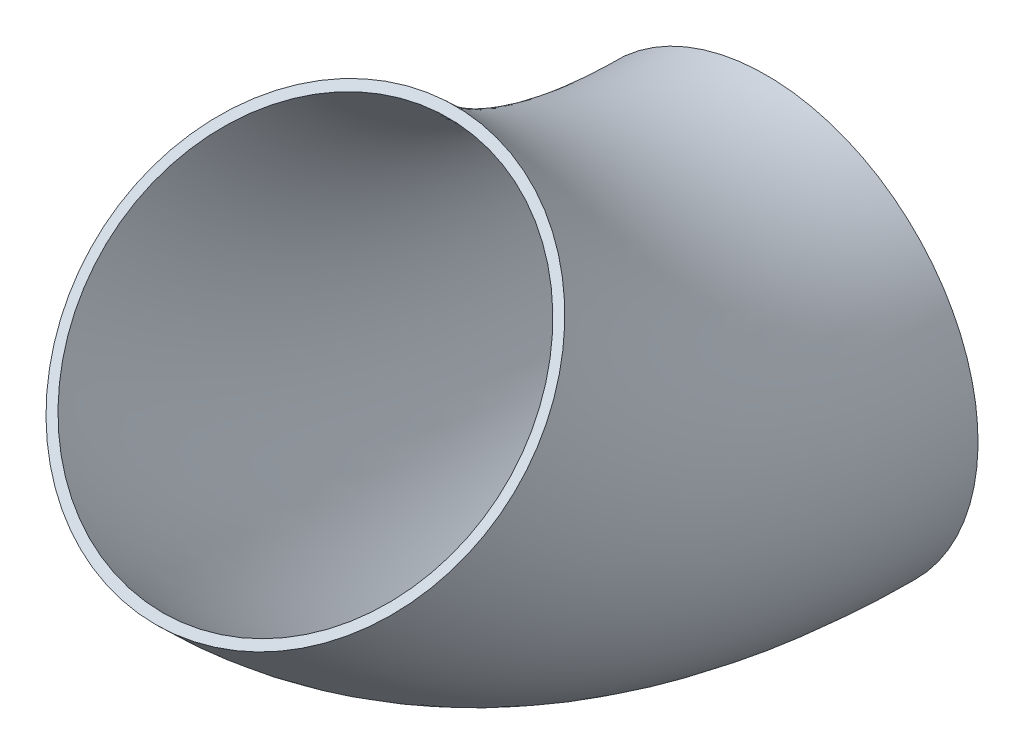
ISO-10303-21;
HEADER;
FILE_DESCRIPTION(('STEP AP214'),'2;1');
FILE_NAME('part.step','',(''),(''),'','','');
FILE_SCHEMA(('AUTOMOTIVE_DESIGN { 1 0 10303 214 1 1 1 1 }'));
ENDSEC;
DATA;
#1=APPLICATION_CONTEXT('core data for automotive mechanical design processes');
#2=APPLICATION_PROTOCOL_DEFINITION('international standard','automotive_design',2000,#1);
#3=PRODUCT_CONTEXT('',#1,'mechanical');
#4=PRODUCT('Part','Part','',(#3));
#5=PRODUCT_RELATED_PRODUCT_CATEGORY('part','',(#4));
#6=PRODUCT_DEFINITION_FORMATION('','',#4);
#7=PRODUCT_DEFINITION_CONTEXT('part definition',#1,'design');
#8=PRODUCT_DEFINITION('design','',#6,#7);
#9=PRODUCT_DEFINITION_SHAPE('','',#8);
#10=(LENGTH_UNIT() NAMED_UNIT(*) SI_UNIT(.MILLI.,.METRE.));
#11=(NAMED_UNIT(*) PLANE_ANGLE_UNIT() SI_UNIT($,.RADIAN.));
#12=(NAMED_UNIT(*) SI_UNIT($,.STERADIAN.) SOLID_ANGLE_UNIT());
#13=UNCERTAINTY_MEASURE_WITH_UNIT(LENGTH_MEASURE(1.E-05),#10,'distance_accuracy_value','');
#14=(GEOMETRIC_REPRESENTATION_CONTEXT(3) GLOBAL_UNCERTAINTY_ASSIGNED_CONTEXT((#13)) GLOBAL_UNIT_ASSIGNED_CONTEXT((#10,
#11,#12)) REPRESENTATION_CONTEXT('',''));
#15=CARTESIAN_POINT('',(0.,0.,0.));
#16=DIRECTION('',(0.,0.,1.));
#17=DIRECTION('',(1.,0.,0.));
#18=AXIS2_PLACEMENT_3D('',#15,#16,#17);
#19=CARTESIAN_POINT('',(0.,100.,0.));
#20=DIRECTION('',(1.,0.,0.));
#21=DIRECTION('',(0.,0.,-1.));
#22=AXIS2_PLACEMENT_3D('',#19,#20,#21);
#23=TOROIDAL_SURFACE('',#22,100.,31.);
#24=CARTESIAN_POINT('',(0.,29.2893218813449,70.7106781186544));
#25=DIRECTION('',(0.,0.707106781186544,0.707106781186551));
#26=DIRECTION('',(1.,0.,0.));
#27=AXIS2_PLACEMENT_3D('',#24,#25,#26);
#28=CIRCLE('',#27,31.);
#29=CARTESIAN_POINT('',(0.,7.36901166456176,92.6309883354373));
#30=VERTEX_POINT('',#29);
#31=EDGE_CURVE('E39',#30,#30,#28,.T.);
#32=CARTESIAN_POINT('',(0.,0.,0.));
#33=DIRECTION('',(0.,0.,1.));
#34=DIRECTION('',(1.,0.,0.));
#35=AXIS2_PLACEMENT_3D('',#32,#33,#34);
#36=CIRCLE('',#35,31.);
#37=CARTESIAN_POINT('',(0.,-31.,0.));
#38=VERTEX_POINT('',#37);
#39=EDGE_CURVE('E47',#38,#38,#36,.T.);
#40=CARTESIAN_POINT('',(0.,100.,0.));
#41=DIRECTION('',(1.,0.,0.));
#42=DIRECTION('',(0.,0.,-1.));
#43=AXIS2_PLACEMENT_3D('',#40,#41,#42);
#44=CIRCLE('',#43,131.);
#45=EDGE_CURVE('',#30,#38,#44,.T.);
#46=ORIENTED_EDGE('',*,*,#31,.T.);
#47=ORIENTED_EDGE('',*,*,#39,.F.);
#48=ORIENTED_EDGE('',*,*,#45,.T.);
#49=ORIENTED_EDGE('',*,*,#45,.F.);
#50=EDGE_LOOP('',(#46,#48,#47,#49));
#51=FACE_BOUND('',#50,.T.);
#52=ADVANCED_FACE('F32',(#51),#23,.F.);
#53=CARTESIAN_POINT('',(0.,100.,0.));
#54=DIRECTION('',(1.,0.,0.));
#55=DIRECTION('',(0.,0.,-1.));
#56=AXIS2_PLACEMENT_3D('',#53,#54,#55);
#57=TOROIDAL_SURFACE('',#56,100.,32.5);
#58=CARTESIAN_POINT('',(0.,29.2893218813449,70.7106781186544));
#59=DIRECTION('',(0.,0.707106781186544,0.707106781186551));
#60=DIRECTION('',(1.,0.,0.));
#61=AXIS2_PLACEMENT_3D('',#58,#59,#60);
#62=CIRCLE('',#61,32.5);
#63=CARTESIAN_POINT('',(0.,6.30835149278193,93.6916485072171));
#64=VERTEX_POINT('',#63);
#65=EDGE_CURVE('E10',#64,#64,#62,.T.);
#66=CARTESIAN_POINT('',(0.,0.,0.));
#67=DIRECTION('',(0.,0.,1.));
#68=DIRECTION('',(1.,0.,0.));
#69=AXIS2_PLACEMENT_3D('',#66,#67,#68);
#70=CIRCLE('',#69,32.5);
#71=CARTESIAN_POINT('',(0.,-32.5,0.));
#72=VERTEX_POINT('',#71);
#73=EDGE_CURVE('E43',#72,#72,#70,.T.);
#74=CARTESIAN_POINT('',(0.,100.,0.));
#75=DIRECTION('',(1.,0.,0.));
#76=DIRECTION('',(0.,0.,-1.));
#77=AXIS2_PLACEMENT_3D('',#74,#75,#76);
#78=CIRCLE('',#77,132.5);
#79=EDGE_CURVE('',#64,#72,#78,.T.);
#80=ORIENTED_EDGE('',*,*,#65,.F.);
#81=ORIENTED_EDGE('',*,*,#73,.T.);
#82=ORIENTED_EDGE('',*,*,#79,.T.);
#83=ORIENTED_EDGE('',*,*,#79,.F.);
#84=EDGE_LOOP('',(#80,#82,#81,#83));
#85=FACE_BOUND('',#84,.T.);
#86=ADVANCED_FACE('F34',(#85),#57,.T.);
#87=CARTESIAN_POINT('',(0.,29.2893218813449,70.7106781186544));
#88=DIRECTION('',(0.,0.707106781186544,0.707106781186551));
#89=DIRECTION('',(1.,0.,0.));
#90=AXIS2_PLACEMENT_3D('',#87,#88,#89);
#91=PLANE('',#90);
#92=ORIENTED_EDGE('',*,*,#31,.F.);
#93=EDGE_LOOP('',(#92));
#94=FACE_BOUND('',#93,.T.);
#95=ORIENTED_EDGE('',*,*,#65,.T.);
#96=EDGE_LOOP('',(#95));
#97=FACE_BOUND('',#96,.T.);
#98=ADVANCED_FACE('F60',(#94,#97),#91,.T.);
#99=CARTESIAN_POINT('',(0.,0.,0.));
#100=DIRECTION('',(0.,0.,1.));
#101=DIRECTION('',(1.,0.,0.));
#102=AXIS2_PLACEMENT_3D('',#99,#100,#101);
#103=PLANE('',#102);
#104=ORIENTED_EDGE('',*,*,#39,.T.);
#105=EDGE_LOOP('',(#104));
#106=FACE_BOUND('',#105,.T.);
#107=ORIENTED_EDGE('',*,*,#73,.F.);
#108=EDGE_LOOP('',(#107));
#109=FACE_BOUND('',#108,.T.);
#110=ADVANCED_FACE('F53',(#106,#109),#103,.F.);
#111=CLOSED_SHELL('',(#52,#86,#98,#110));
#112=MANIFOLD_SOLID_BREP('B2',#111);
#113=ADVANCED_BREP_SHAPE_REPRESENTATION('',(#18,#112),#14);
#114=SHAPE_DEFINITION_REPRESENTATION(#9,#113);
ENDSEC;
END-ISO-10303-21;
